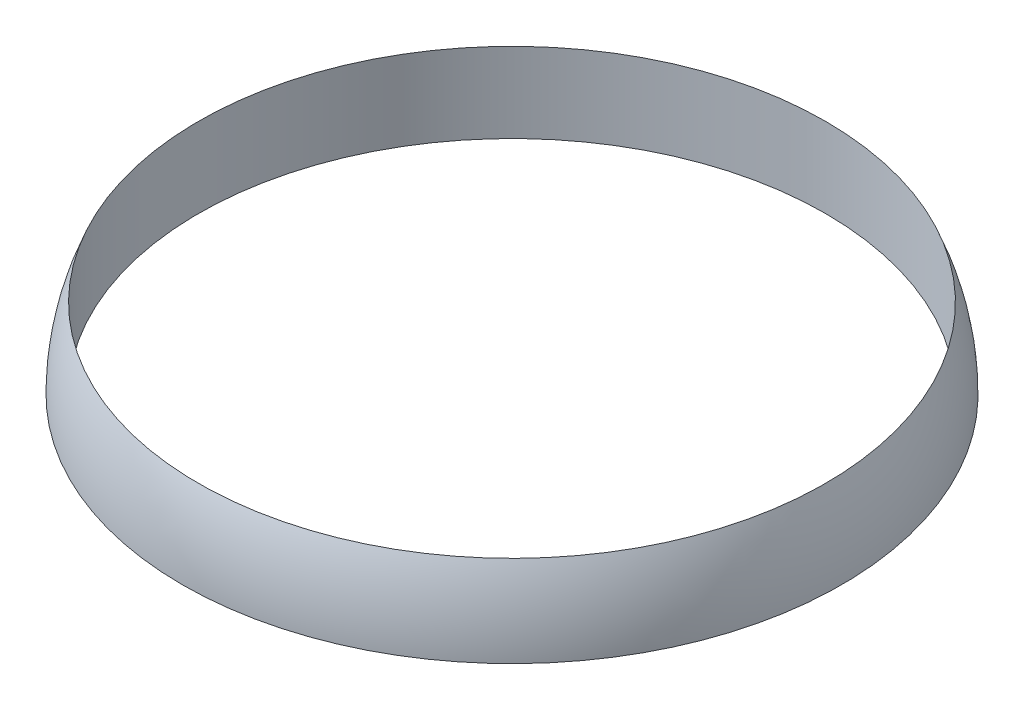
ISO-10303-21;
HEADER;
FILE_DESCRIPTION(('STEP AP214'),'2;1');
FILE_NAME('part.step','',(''),(''),'','','');
FILE_SCHEMA(('AUTOMOTIVE_DESIGN { 1 0 10303 214 1 1 1 1 }'));
ENDSEC;
DATA;
#1=APPLICATION_CONTEXT('core data for automotive mechanical design processes');
#2=APPLICATION_PROTOCOL_DEFINITION('international standard','automotive_design',2000,#1);
#3=PRODUCT_CONTEXT('',#1,'mechanical');
#4=PRODUCT('Part','Part','',(#3));
#5=PRODUCT_RELATED_PRODUCT_CATEGORY('part','',(#4));
#6=PRODUCT_DEFINITION_FORMATION('','',#4);
#7=PRODUCT_DEFINITION_CONTEXT('part definition',#1,'design');
#8=PRODUCT_DEFINITION('design','',#6,#7);
#9=PRODUCT_DEFINITION_SHAPE('','',#8);
#10=(LENGTH_UNIT() NAMED_UNIT(*) SI_UNIT(.MILLI.,.METRE.));
#11=(NAMED_UNIT(*) PLANE_ANGLE_UNIT() SI_UNIT($,.RADIAN.));
#12=(NAMED_UNIT(*) SI_UNIT($,.STERADIAN.) SOLID_ANGLE_UNIT());
#13=UNCERTAINTY_MEASURE_WITH_UNIT(LENGTH_MEASURE(1.E-05),#10,'distance_accuracy_value','');
#14=(GEOMETRIC_REPRESENTATION_CONTEXT(3) GLOBAL_UNCERTAINTY_ASSIGNED_CONTEXT((#13)) GLOBAL_UNIT_ASSIGNED_CONTEXT((#10,
#11,#12)) REPRESENTATION_CONTEXT('',''));
#15=CARTESIAN_POINT('',(0.,0.,0.));
#16=DIRECTION('',(0.,0.,1.));
#17=DIRECTION('',(1.,0.,0.));
#18=AXIS2_PLACEMENT_3D('',#15,#16,#17);
#19=CARTESIAN_POINT('',(0.,0.,-78.5));
#20=DIRECTION('',(0.,-1.,0.));
#21=DIRECTION('',(0.,0.,-1.));
#22=AXIS2_PLACEMENT_3D('',#19,#20,#21);
#23=PLANE('',#22);
#24=CARTESIAN_POINT('',(0.,0.,0.));
#25=DIRECTION('',(0.,-1.,0.));
#26=DIRECTION('',(0.,0.,-1.));
#27=AXIS2_PLACEMENT_3D('',#24,#25,#26);
#28=CIRCLE('',#27,82.5);
#29=CARTESIAN_POINT('',(0.,0.,-82.5));
#30=VERTEX_POINT('',#29);
#31=EDGE_CURVE('E10',#30,#30,#28,.T.);
#32=ORIENTED_EDGE('',*,*,#31,.T.);
#33=EDGE_LOOP('',(#32));
#34=FACE_BOUND('',#33,.T.);
#35=CARTESIAN_POINT('',(0.,0.,0.));
#36=DIRECTION('',(0.,-1.,0.));
#37=DIRECTION('',(0.,0.,-1.));
#38=AXIS2_PLACEMENT_3D('',#35,#36,#37);
#39=CIRCLE('',#38,78.5);
#40=CARTESIAN_POINT('',(0.,0.,-78.5));
#41=VERTEX_POINT('',#40);
#42=EDGE_CURVE('E43',#41,#41,#39,.T.);
#43=ORIENTED_EDGE('',*,*,#42,.F.);
#44=EDGE_LOOP('',(#43));
#45=FACE_BOUND('',#44,.T.);
#46=ADVANCED_FACE('F33',(#34,#45),#23,.T.);
#47=CARTESIAN_POINT('',(0.,0.,0.));
#48=DIRECTION('',(0.,-1.,0.));
#49=DIRECTION('',(0.,0.,-1.));
#50=AXIS2_PLACEMENT_3D('',#47,#48,#49);
#51=DEGENERATE_TOROIDAL_SURFACE('',#50,30.5,52.,.T.);
#52=CARTESIAN_POINT('',(0.,20.,0.));
#53=DIRECTION('',(0.,-1.,0.));
#54=DIRECTION('',(0.,0.,-1.));
#55=AXIS2_PLACEMENT_3D('',#52,#53,#54);
#56=CIRCLE('',#55,78.5);
#57=CARTESIAN_POINT('',(0.,20.,-78.5));
#58=VERTEX_POINT('',#57);
#59=EDGE_CURVE('E39',#58,#58,#56,.T.);
#60=ORIENTED_EDGE('',*,*,#59,.T.);
#61=EDGE_LOOP('',(#60));
#62=FACE_BOUND('',#61,.T.);
#63=ORIENTED_EDGE('',*,*,#31,.F.);
#64=EDGE_LOOP('',(#63));
#65=FACE_BOUND('',#64,.T.);
#66=ADVANCED_FACE('F54',(#62,#65),#51,.T.);
#67=CARTESIAN_POINT('',(0.,0.,0.));
#68=DIRECTION('',(0.,-1.,0.));
#69=DIRECTION('',(0.,0.,-1.));
#70=AXIS2_PLACEMENT_3D('',#67,#68,#69);
#71=CYLINDRICAL_SURFACE('',#70,78.5);
#72=ORIENTED_EDGE('',*,*,#42,.T.);
#73=EDGE_LOOP('',(#72));
#74=FACE_BOUND('',#73,.T.);
#75=ORIENTED_EDGE('',*,*,#59,.F.);
#76=EDGE_LOOP('',(#75));
#77=FACE_BOUND('',#76,.T.);
#78=ADVANCED_FACE('F50',(#74,#77),#71,.F.);
#79=CLOSED_SHELL('',(#46,#66,#78));
#80=MANIFOLD_SOLID_BREP('B2',#79);
#81=ADVANCED_BREP_SHAPE_REPRESENTATION('',(#18,#80),#14);
#82=SHAPE_DEFINITION_REPRESENTATION(#9,#81);
ENDSEC;
END-ISO-10303-21;
